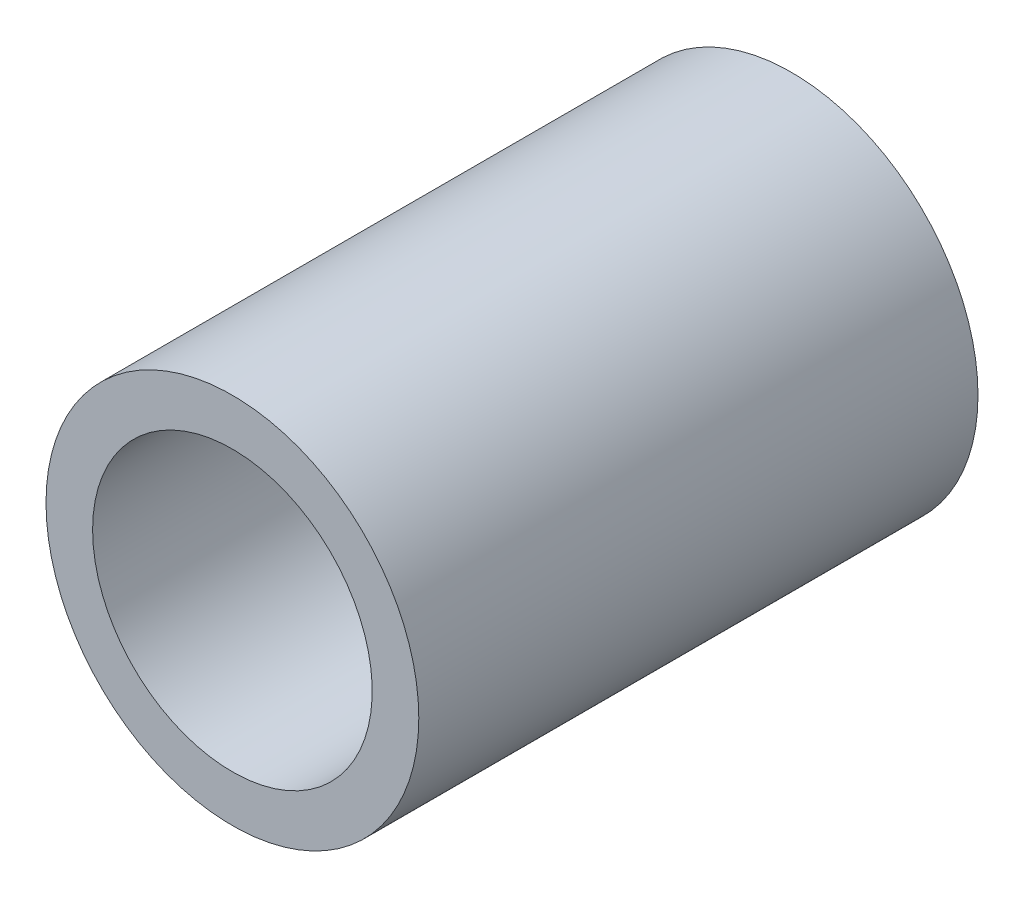
ISO-10303-21;
HEADER;
FILE_DESCRIPTION(('STEP AP214'),'2;1');
FILE_NAME('part.step','',(''),(''),'','','');
FILE_SCHEMA(('AUTOMOTIVE_DESIGN { 1 0 10303 214 1 1 1 1 }'));
ENDSEC;
DATA;
#1=APPLICATION_CONTEXT('core data for automotive mechanical design processes');
#2=APPLICATION_PROTOCOL_DEFINITION('international standard','automotive_design',2000,#1);
#3=PRODUCT_CONTEXT('',#1,'mechanical');
#4=PRODUCT('Part','Part','',(#3));
#5=PRODUCT_RELATED_PRODUCT_CATEGORY('part','',(#4));
#6=PRODUCT_DEFINITION_FORMATION('','',#4);
#7=PRODUCT_DEFINITION_CONTEXT('part definition',#1,'design');
#8=PRODUCT_DEFINITION('design','',#6,#7);
#9=PRODUCT_DEFINITION_SHAPE('','',#8);
#10=(LENGTH_UNIT() NAMED_UNIT(*) SI_UNIT(.MILLI.,.METRE.));
#11=(NAMED_UNIT(*) PLANE_ANGLE_UNIT() SI_UNIT($,.RADIAN.));
#12=(NAMED_UNIT(*) SI_UNIT($,.STERADIAN.) SOLID_ANGLE_UNIT());
#13=UNCERTAINTY_MEASURE_WITH_UNIT(LENGTH_MEASURE(1.E-05),#10,'distance_accuracy_value','');
#14=(GEOMETRIC_REPRESENTATION_CONTEXT(3) GLOBAL_UNCERTAINTY_ASSIGNED_CONTEXT((#13)) GLOBAL_UNIT_ASSIGNED_CONTEXT((#10,
#11,#12)) REPRESENTATION_CONTEXT('',''));
#15=CARTESIAN_POINT('',(0.,0.,0.));
#16=DIRECTION('',(0.,0.,1.));
#17=DIRECTION('',(1.,0.,0.));
#18=AXIS2_PLACEMENT_3D('',#15,#16,#17);
#19=CARTESIAN_POINT('',(0.,0.,38.1));
#20=DIRECTION('',(0.,0.,1.));
#21=DIRECTION('',(1.,0.,0.));
#22=AXIS2_PLACEMENT_3D('',#19,#20,#21);
#23=PLANE('',#22);
#24=CARTESIAN_POINT('',(0.,0.,38.1));
#25=DIRECTION('',(0.,0.,1.));
#26=DIRECTION('',(1.,0.,0.));
#27=AXIS2_PLACEMENT_3D('',#24,#25,#26);
#28=CIRCLE('',#27,12.7);
#29=CARTESIAN_POINT('',(-12.7,0.,38.1));
#30=VERTEX_POINT('',#29);
#31=EDGE_CURVE('E10',#30,#30,#28,.T.);
#32=ORIENTED_EDGE('',*,*,#31,.T.);
#33=EDGE_LOOP('',(#32));
#34=FACE_BOUND('',#33,.T.);
#35=CARTESIAN_POINT('',(0.,0.,38.1));
#36=DIRECTION('',(0.,0.,1.));
#37=DIRECTION('',(1.,0.,0.));
#38=AXIS2_PLACEMENT_3D('',#35,#36,#37);
#39=CIRCLE('',#38,9.525);
#40=CARTESIAN_POINT('',(-9.525,0.,38.1));
#41=VERTEX_POINT('',#40);
#42=EDGE_CURVE('E44',#41,#41,#39,.T.);
#43=ORIENTED_EDGE('',*,*,#42,.F.);
#44=EDGE_LOOP('',(#43));
#45=FACE_BOUND('',#44,.T.);
#46=ADVANCED_FACE('F33',(#34,#45),#23,.T.);
#47=CARTESIAN_POINT('',(0.,0.,0.));
#48=DIRECTION('',(0.,0.,1.));
#49=DIRECTION('',(1.,0.,0.));
#50=AXIS2_PLACEMENT_3D('',#47,#48,#49);
#51=PLANE('',#50);
#52=CARTESIAN_POINT('',(0.,0.,0.));
#53=DIRECTION('',(0.,0.,1.));
#54=DIRECTION('',(1.,0.,0.));
#55=AXIS2_PLACEMENT_3D('',#52,#53,#54);
#56=CIRCLE('',#55,12.7);
#57=CARTESIAN_POINT('',(-12.7,0.,0.));
#58=VERTEX_POINT('',#57);
#59=EDGE_CURVE('E37',#58,#58,#56,.T.);
#60=ORIENTED_EDGE('',*,*,#59,.F.);
#61=EDGE_LOOP('',(#60));
#62=FACE_BOUND('',#61,.T.);
#63=CARTESIAN_POINT('',(0.,0.,0.));
#64=DIRECTION('',(0.,0.,1.));
#65=DIRECTION('',(1.,0.,0.));
#66=AXIS2_PLACEMENT_3D('',#63,#64,#65);
#67=CIRCLE('',#66,9.525);
#68=CARTESIAN_POINT('',(-9.525,0.,0.));
#69=VERTEX_POINT('',#68);
#70=EDGE_CURVE('E46',#69,#69,#67,.T.);
#71=ORIENTED_EDGE('',*,*,#70,.T.);
#72=EDGE_LOOP('',(#71));
#73=FACE_BOUND('',#72,.T.);
#74=ADVANCED_FACE('F56',(#62,#73),#51,.F.);
#75=CARTESIAN_POINT('',(0.,0.,38.1));
#76=DIRECTION('',(0.,0.,-1.));
#77=DIRECTION('',(-1.,0.,0.));
#78=AXIS2_PLACEMENT_3D('',#75,#76,#77);
#79=CYLINDRICAL_SURFACE('',#78,12.7);
#80=CARTESIAN_POINT('',(-12.7,0.,38.1));
#81=CARTESIAN_POINT('',(-12.7,0.,37.703125));
#82=CARTESIAN_POINT('',(-12.7,0.,37.30625));
#83=CARTESIAN_POINT('',(-12.7,0.,36.5125));
#84=CARTESIAN_POINT('',(-12.7,0.,36.115625));
#85=CARTESIAN_POINT('',(-12.7,0.,35.321875));
#86=CARTESIAN_POINT('',(-12.7,0.,34.925));
#87=CARTESIAN_POINT('',(-12.7,0.,34.13125));
#88=CARTESIAN_POINT('',(-12.7,0.,33.734375));
#89=CARTESIAN_POINT('',(-12.7,0.,32.940625));
#90=CARTESIAN_POINT('',(-12.7,0.,32.54375));
#91=CARTESIAN_POINT('',(-12.7,0.,31.75));
#92=CARTESIAN_POINT('',(-12.7,0.,31.353125));
#93=CARTESIAN_POINT('',(-12.7,0.,30.559375));
#94=CARTESIAN_POINT('',(-12.7,0.,30.1625));
#95=CARTESIAN_POINT('',(-12.7,0.,29.36875));
#96=CARTESIAN_POINT('',(-12.7,0.,28.971875));
#97=CARTESIAN_POINT('',(-12.7,0.,28.178125));
#98=CARTESIAN_POINT('',(-12.7,0.,27.78125));
#99=CARTESIAN_POINT('',(-12.7,0.,26.9875));
#100=CARTESIAN_POINT('',(-12.7,0.,26.590625));
#101=CARTESIAN_POINT('',(-12.7,0.,25.796875));
#102=CARTESIAN_POINT('',(-12.7,0.,25.4));
#103=CARTESIAN_POINT('',(-12.7,0.,24.60625));
#104=CARTESIAN_POINT('',(-12.7,0.,24.209375));
#105=CARTESIAN_POINT('',(-12.7,0.,23.415625));
#106=CARTESIAN_POINT('',(-12.7,0.,23.01875));
#107=CARTESIAN_POINT('',(-12.7,0.,22.225));
#108=CARTESIAN_POINT('',(-12.7,0.,21.828125));
#109=CARTESIAN_POINT('',(-12.7,0.,21.034375));
#110=CARTESIAN_POINT('',(-12.7,0.,20.6375));
#111=CARTESIAN_POINT('',(-12.7,0.,19.84375));
#112=CARTESIAN_POINT('',(-12.7,0.,19.446875));
#113=CARTESIAN_POINT('',(-12.7,0.,18.653125));
#114=CARTESIAN_POINT('',(-12.7,0.,18.25625));
#115=CARTESIAN_POINT('',(-12.7,0.,17.4625));
#116=CARTESIAN_POINT('',(-12.7,0.,17.065625));
#117=CARTESIAN_POINT('',(-12.7,0.,16.271875));
#118=CARTESIAN_POINT('',(-12.7,0.,15.875));
#119=CARTESIAN_POINT('',(-12.7,0.,15.08125));
#120=CARTESIAN_POINT('',(-12.7,0.,14.684375));
#121=CARTESIAN_POINT('',(-12.7,0.,13.890625));
#122=CARTESIAN_POINT('',(-12.7,0.,13.49375));
#123=CARTESIAN_POINT('',(-12.7,0.,12.7));
#124=CARTESIAN_POINT('',(-12.7,0.,12.303125));
#125=CARTESIAN_POINT('',(-12.7,0.,11.509375));
#126=CARTESIAN_POINT('',(-12.7,0.,11.1125));
#127=CARTESIAN_POINT('',(-12.7,0.,10.31875));
#128=CARTESIAN_POINT('',(-12.7,0.,9.92187499999999));
#129=CARTESIAN_POINT('',(-12.7,0.,9.128125));
#130=CARTESIAN_POINT('',(-12.7,0.,8.73124999999999));
#131=CARTESIAN_POINT('',(-12.7,0.,7.93749999999999));
#132=CARTESIAN_POINT('',(-12.7,0.,7.54062499999999));
#133=CARTESIAN_POINT('',(-12.7,0.,6.746875));
#134=CARTESIAN_POINT('',(-12.7,0.,6.35));
#135=CARTESIAN_POINT('',(-12.7,0.,5.55625));
#136=CARTESIAN_POINT('',(-12.7,0.,5.159375));
#137=CARTESIAN_POINT('',(-12.7,0.,4.365625));
#138=CARTESIAN_POINT('',(-12.7,0.,3.96875));
#139=CARTESIAN_POINT('',(-12.7,0.,3.175));
#140=CARTESIAN_POINT('',(-12.7,0.,2.778125));
#141=CARTESIAN_POINT('',(-12.7,0.,1.984375));
#142=CARTESIAN_POINT('',(-12.7,0.,1.5875));
#143=CARTESIAN_POINT('',(-12.7,0.,0.79375));
#144=CARTESIAN_POINT('',(-12.7,0.,0.396875));
#145=CARTESIAN_POINT('',(-12.7,0.,0.));
#146=B_SPLINE_CURVE_WITH_KNOTS('',3,(#80,#81,#82,#83,#84,#85,#86,#87,#88,#89,#90,#91,#92,#93,
#94,#95,#96,#97,#98,#99,#100,#101,#102,#103,#104,#105,#106,#107,#108,#109,#110,#111,#112,#113,
#114,#115,#116,#117,#118,#119,#120,#121,#122,#123,#124,#125,#126,#127,#128,#129,#130,#131,#132,
#133,#134,#135,#136,#137,#138,#139,#140,#141,#142,#143,#144,#145),.UNSPECIFIED.,.F.,.F.,(4,2,2,
2,2,2,2,2,2,2,2,2,2,2,2,2,2,2,2,2,2,2,2,2,2,2,2,2,2,2,2,2,4),(0.,1.190625,2.38125,3.571875,
4.7625,5.953125,7.14375,8.334375,9.52500000000001,10.715625,11.90625,13.096875,14.2875,
15.478125,16.66875,17.859375,19.05,20.240625,21.43125,22.621875,23.8125,25.003125,26.19375,
27.384375,28.575,29.765625,30.95625,32.146875,33.3375,34.528125,35.71875,36.909375,38.1),.UNSPECIFIED.);
#147=EDGE_CURVE('BSEAM35',#30,#58,#146,.T.);
#148=ORIENTED_EDGE('',*,*,#31,.F.);
#149=ORIENTED_EDGE('',*,*,#59,.T.);
#150=ORIENTED_EDGE('',*,*,#147,.T.);
#151=ORIENTED_EDGE('',*,*,#147,.F.);
#152=EDGE_LOOP('',(#148,#150,#149,#151));
#153=FACE_BOUND('',#152,.T.);
#154=ADVANCED_FACE('F35',(#153),#79,.T.);
#155=CARTESIAN_POINT('',(0.,0.,38.1));
#156=DIRECTION('',(0.,0.,-1.));
#157=DIRECTION('',(-1.,0.,0.));
#158=AXIS2_PLACEMENT_3D('',#155,#156,#157);
#159=CYLINDRICAL_SURFACE('',#158,9.525);
#160=CARTESIAN_POINT('',(-9.525,0.,38.1));
#161=CARTESIAN_POINT('',(-9.525,0.,37.703125));
#162=CARTESIAN_POINT('',(-9.525,0.,37.30625));
#163=CARTESIAN_POINT('',(-9.525,0.,36.5125));
#164=CARTESIAN_POINT('',(-9.525,0.,36.115625));
#165=CARTESIAN_POINT('',(-9.525,0.,35.321875));
#166=CARTESIAN_POINT('',(-9.525,0.,34.925));
#167=CARTESIAN_POINT('',(-9.525,0.,34.13125));
#168=CARTESIAN_POINT('',(-9.525,0.,33.734375));
#169=CARTESIAN_POINT('',(-9.525,0.,32.940625));
#170=CARTESIAN_POINT('',(-9.525,0.,32.54375));
#171=CARTESIAN_POINT('',(-9.525,0.,31.75));
#172=CARTESIAN_POINT('',(-9.525,0.,31.353125));
#173=CARTESIAN_POINT('',(-9.525,0.,30.559375));
#174=CARTESIAN_POINT('',(-9.525,0.,30.1625));
#175=CARTESIAN_POINT('',(-9.525,0.,29.36875));
#176=CARTESIAN_POINT('',(-9.525,0.,28.971875));
#177=CARTESIAN_POINT('',(-9.525,0.,28.178125));
#178=CARTESIAN_POINT('',(-9.525,0.,27.78125));
#179=CARTESIAN_POINT('',(-9.525,0.,26.9875));
#180=CARTESIAN_POINT('',(-9.525,0.,26.590625));
#181=CARTESIAN_POINT('',(-9.525,0.,25.796875));
#182=CARTESIAN_POINT('',(-9.525,0.,25.4));
#183=CARTESIAN_POINT('',(-9.525,0.,24.60625));
#184=CARTESIAN_POINT('',(-9.525,0.,24.209375));
#185=CARTESIAN_POINT('',(-9.525,0.,23.415625));
#186=CARTESIAN_POINT('',(-9.525,0.,23.01875));
#187=CARTESIAN_POINT('',(-9.525,0.,22.225));
#188=CARTESIAN_POINT('',(-9.525,0.,21.828125));
#189=CARTESIAN_POINT('',(-9.525,0.,21.034375));
#190=CARTESIAN_POINT('',(-9.525,0.,20.6375));
#191=CARTESIAN_POINT('',(-9.525,0.,19.84375));
#192=CARTESIAN_POINT('',(-9.525,0.,19.446875));
#193=CARTESIAN_POINT('',(-9.525,0.,18.653125));
#194=CARTESIAN_POINT('',(-9.525,0.,18.25625));
#195=CARTESIAN_POINT('',(-9.525,0.,17.4625));
#196=CARTESIAN_POINT('',(-9.525,0.,17.065625));
#197=CARTESIAN_POINT('',(-9.525,0.,16.271875));
#198=CARTESIAN_POINT('',(-9.525,0.,15.875));
#199=CARTESIAN_POINT('',(-9.525,0.,15.08125));
#200=CARTESIAN_POINT('',(-9.525,0.,14.684375));
#201=CARTESIAN_POINT('',(-9.525,0.,13.890625));
#202=CARTESIAN_POINT('',(-9.525,0.,13.49375));
#203=CARTESIAN_POINT('',(-9.525,0.,12.7));
#204=CARTESIAN_POINT('',(-9.525,0.,12.303125));
#205=CARTESIAN_POINT('',(-9.525,0.,11.509375));
#206=CARTESIAN_POINT('',(-9.525,0.,11.1125));
#207=CARTESIAN_POINT('',(-9.525,0.,10.31875));
#208=CARTESIAN_POINT('',(-9.525,0.,9.92187499999999));
#209=CARTESIAN_POINT('',(-9.525,0.,9.128125));
#210=CARTESIAN_POINT('',(-9.525,0.,8.73124999999999));
#211=CARTESIAN_POINT('',(-9.525,0.,7.93749999999999));
#212=CARTESIAN_POINT('',(-9.525,0.,7.54062499999999));
#213=CARTESIAN_POINT('',(-9.525,0.,6.746875));
#214=CARTESIAN_POINT('',(-9.525,0.,6.35));
#215=CARTESIAN_POINT('',(-9.525,0.,5.55625));
#216=CARTESIAN_POINT('',(-9.525,0.,5.159375));
#217=CARTESIAN_POINT('',(-9.525,0.,4.365625));
#218=CARTESIAN_POINT('',(-9.525,0.,3.96875));
#219=CARTESIAN_POINT('',(-9.525,0.,3.175));
#220=CARTESIAN_POINT('',(-9.525,0.,2.778125));
#221=CARTESIAN_POINT('',(-9.525,0.,1.984375));
#222=CARTESIAN_POINT('',(-9.525,0.,1.5875));
#223=CARTESIAN_POINT('',(-9.525,0.,0.79375));
#224=CARTESIAN_POINT('',(-9.525,0.,0.396875));
#225=CARTESIAN_POINT('',(-9.525,0.,0.));
#226=B_SPLINE_CURVE_WITH_KNOTS('',3,(#160,#161,#162,#163,#164,#165,#166,#167,#168,#169,#170,
#171,#172,#173,#174,#175,#176,#177,#178,#179,#180,#181,#182,#183,#184,#185,#186,#187,#188,#189,
#190,#191,#192,#193,#194,#195,#196,#197,#198,#199,#200,#201,#202,#203,#204,#205,#206,#207,#208,
#209,#210,#211,#212,#213,#214,#215,#216,#217,#218,#219,#220,#221,#222,#223,#224,#225),
.UNSPECIFIED.,.F.,.F.,(4,2,2,2,2,2,2,2,2,2,2,2,2,2,2,2,2,2,2,2,2,2,2,2,2,2,2,2,2,2,2,2,4),(0.,
1.190625,2.38125,3.571875,4.7625,5.953125,7.14375,8.334375,9.52500000000001,10.715625,11.90625,
13.096875,14.2875,15.478125,16.66875,17.859375,19.05,20.240625,21.43125,22.621875,23.8125,
25.003125,26.19375,27.384375,28.575,29.765625,30.95625,32.146875,33.3375,34.528125,35.71875,
36.909375,38.1),.UNSPECIFIED.);
#227=EDGE_CURVE('BSEAM52',#41,#69,#226,.T.);
#228=ORIENTED_EDGE('',*,*,#42,.T.);
#229=ORIENTED_EDGE('',*,*,#70,.F.);
#230=ORIENTED_EDGE('',*,*,#227,.T.);
#231=ORIENTED_EDGE('',*,*,#227,.F.);
#232=EDGE_LOOP('',(#228,#230,#229,#231));
#233=FACE_BOUND('',#232,.T.);
#234=ADVANCED_FACE('F52',(#233),#159,.F.);
#235=CLOSED_SHELL('',(#46,#74,#154,#234));
#236=MANIFOLD_SOLID_BREP('B2',#235);
#237=ADVANCED_BREP_SHAPE_REPRESENTATION('',(#18,#236),#14);
#238=SHAPE_DEFINITION_REPRESENTATION(#9,#237);
ENDSEC;
END-ISO-10303-21;
